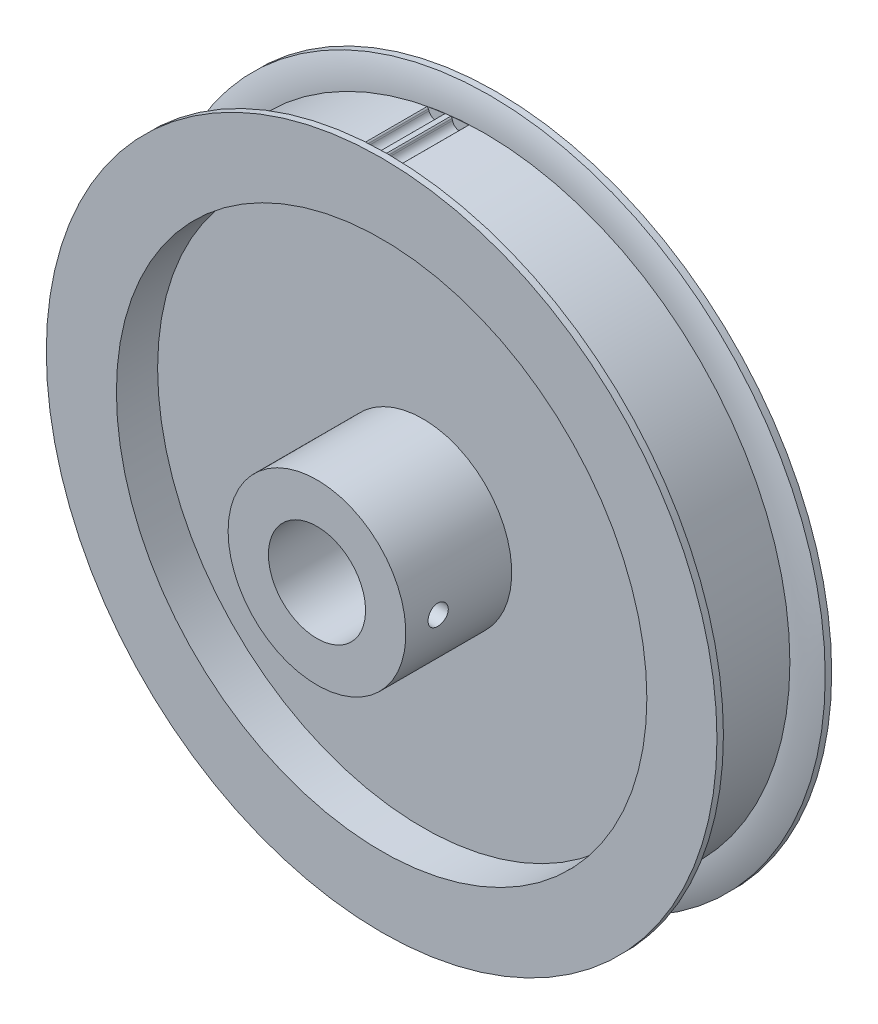
ISO-10303-21;
HEADER;
FILE_DESCRIPTION(('STEP AP214'),'2;1');
FILE_NAME('part.step','',(''),(''),'','','');
FILE_SCHEMA(('AUTOMOTIVE_DESIGN { 1 0 10303 214 1 1 1 1 }'));
ENDSEC;
DATA;
#1=APPLICATION_CONTEXT('core data for automotive mechanical design processes');
#2=APPLICATION_PROTOCOL_DEFINITION('international standard','automotive_design',2000,#1);
#3=PRODUCT_CONTEXT('',#1,'mechanical');
#4=PRODUCT('Part','Part','',(#3));
#5=PRODUCT_RELATED_PRODUCT_CATEGORY('part','',(#4));
#6=PRODUCT_DEFINITION_FORMATION('','',#4);
#7=PRODUCT_DEFINITION_CONTEXT('part definition',#1,'design');
#8=PRODUCT_DEFINITION('design','',#6,#7);
#9=PRODUCT_DEFINITION_SHAPE('','',#8);
#10=(LENGTH_UNIT() NAMED_UNIT(*) SI_UNIT(.MILLI.,.METRE.));
#11=(NAMED_UNIT(*) PLANE_ANGLE_UNIT() SI_UNIT($,.RADIAN.));
#12=(NAMED_UNIT(*) SI_UNIT($,.STERADIAN.) SOLID_ANGLE_UNIT());
#13=UNCERTAINTY_MEASURE_WITH_UNIT(LENGTH_MEASURE(1.E-05),#10,'distance_accuracy_value','');
#14=(GEOMETRIC_REPRESENTATION_CONTEXT(3) GLOBAL_UNCERTAINTY_ASSIGNED_CONTEXT((#13)) GLOBAL_UNIT_ASSIGNED_CONTEXT((#10,
#11,#12)) REPRESENTATION_CONTEXT('',''));
#15=CARTESIAN_POINT('',(0.,0.,0.));
#16=DIRECTION('',(0.,0.,1.));
#17=DIRECTION('',(1.,0.,0.));
#18=AXIS2_PLACEMENT_3D('',#15,#16,#17);
#19=CARTESIAN_POINT('',(0.,0.,-7.1));
#20=DIRECTION('',(0.,0.,-1.));
#21=DIRECTION('',(-1.,0.,0.));
#22=AXIS2_PLACEMENT_3D('',#19,#20,#21);
#23=PLANE('',#22);
#24=CARTESIAN_POINT('',(0.,0.,-7.1));
#25=DIRECTION('',(0.,0.,-1.));
#26=DIRECTION('',(-1.,0.,0.));
#27=AXIS2_PLACEMENT_3D('',#24,#25,#26);
#28=CIRCLE('',#27,32.825);
#29=CARTESIAN_POINT('',(-32.825,0.,-7.1));
#30=VERTEX_POINT('',#29);
#31=EDGE_CURVE('E133',#30,#30,#28,.F.);
#32=ORIENTED_EDGE('',*,*,#31,.T.);
#33=EDGE_LOOP('',(#32));
#34=FACE_BOUND('',#33,.T.);
#35=CARTESIAN_POINT('',(0.,0.,-7.1));
#36=DIRECTION('',(0.,0.,-1.));
#37=DIRECTION('',(-1.,0.,0.));
#38=AXIS2_PLACEMENT_3D('',#35,#36,#37);
#39=CIRCLE('',#38,41.5);
#40=CARTESIAN_POINT('',(-41.5,0.,-7.1));
#41=VERTEX_POINT('',#40);
#42=EDGE_CURVE('E19',#41,#41,#39,.F.);
#43=ORIENTED_EDGE('',*,*,#42,.F.);
#44=EDGE_LOOP('',(#43));
#45=FACE_BOUND('',#44,.T.);
#46=ADVANCED_FACE('F16',(#34,#45),#23,.T.);
#47=CARTESIAN_POINT('',(0.,0.,16.21));
#48=DIRECTION('',(0.,0.,-1.));
#49=DIRECTION('',(-1.,0.,0.));
#50=AXIS2_PLACEMENT_3D('',#47,#48,#49);
#51=CYLINDRICAL_SURFACE('',#50,41.5);
#52=CARTESIAN_POINT('',(0.,0.,-6.29976478792073));
#53=DIRECTION('',(0.,0.,-1.));
#54=DIRECTION('',(0.,-1.,0.));
#55=AXIS2_PLACEMENT_3D('',#52,#53,#54);
#56=CIRCLE('',#55,41.5000000000001);
#57=CARTESIAN_POINT('',(0.,-41.5000000000001,-6.29976478792073));
#58=VERTEX_POINT('',#57);
#59=EDGE_CURVE('E122',#58,#58,#56,.F.);
#60=ORIENTED_EDGE('',*,*,#59,.F.);
#61=EDGE_LOOP('',(#60));
#62=FACE_BOUND('',#61,.T.);
#63=ORIENTED_EDGE('',*,*,#42,.T.);
#64=EDGE_LOOP('',(#63));
#65=FACE_BOUND('',#64,.T.);
#66=ADVANCED_FACE('F316',(#62,#65),#51,.T.);
#67=CARTESIAN_POINT('',(-17.53807496134,32.91539633706,5.55));
#68=DIRECTION('',(0.,0.,1.));
#69=DIRECTION('',(1.,0.,0.));
#70=AXIS2_PLACEMENT_3D('',#67,#68,#69);
#71=CYLINDRICAL_SURFACE('',#70,11.43);
#72=DIRECTION('',(0.,0.,1.));
#73=VECTOR('',#72,1.);
#74=CARTESIAN_POINT('',(-6.86234109410195,36.9987290930293,5.55));
#75=LINE('',#74,#73);
#76=CARTESIAN_POINT('',(-6.8623410941023,36.9987290930262,5.55));
#77=VERTEX_POINT('',#76);
#78=CARTESIAN_POINT('',(-6.8623410941023,36.9987290930262,-5.55));
#79=VERTEX_POINT('',#78);
#80=EDGE_CURVE('E109',#77,#79,#75,.F.);
#81=ORIENTED_EDGE('',*,*,#80,.F.);
#82=CARTESIAN_POINT('',(-17.53807496134,32.91539633706,5.55));
#83=DIRECTION('',(0.,0.,1.));
#84=DIRECTION('',(1.,0.,0.));
#85=AXIS2_PLACEMENT_3D('',#82,#83,#84);
#86=CIRCLE('',#85,11.43);
#87=CARTESIAN_POINT('',(-6.79640029684461,36.8219709750492,5.55));
#88=VERTEX_POINT('',#87);
#89=EDGE_CURVE('E114',#77,#88,#86,.F.);
#90=ORIENTED_EDGE('',*,*,#89,.T.);
#91=DIRECTION('',(0.,0.,1.));
#92=VECTOR('',#91,1.);
#93=CARTESIAN_POINT('',(-6.79640029684293,36.82197097505,5.55));
#94=LINE('',#93,#92);
#95=CARTESIAN_POINT('',(-6.79640029684461,36.8219709750492,-5.55));
#96=VERTEX_POINT('',#95);
#97=EDGE_CURVE('E112',#88,#96,#94,.F.);
#98=ORIENTED_EDGE('',*,*,#97,.T.);
#99=CARTESIAN_POINT('',(-17.53807496134,32.91539633706,-5.55));
#100=DIRECTION('',(0.,0.,1.));
#101=DIRECTION('',(1.,0.,0.));
#102=AXIS2_PLACEMENT_3D('',#99,#100,#101);
#103=CIRCLE('',#102,11.43);
#104=EDGE_CURVE('E103',#96,#79,#103,.T.);
#105=ORIENTED_EDGE('',*,*,#104,.T.);
#106=EDGE_LOOP('',(#81,#90,#98,#105));
#107=FACE_BOUND('',#106,.T.);
#108=ADVANCED_FACE('F108',(#107),#71,.T.);
#109=CARTESIAN_POINT('',(6.508283630513,36.72396538448,5.55));
#110=DIRECTION('',(0.,0.,1.));
#111=DIRECTION('',(1.,0.,0.));
#112=AXIS2_PLACEMENT_3D('',#109,#110,#111);
#113=CYLINDRICAL_SURFACE('',#112,11.43);
#114=DIRECTION('',(0.,0.,1.));
#115=VECTOR('',#114,1.);
#116=CARTESIAN_POINT('',(-4.91485400800908,37.11997863095,5.55));
#117=LINE('',#116,#115);
#118=CARTESIAN_POINT('',(-4.91485400800905,37.1199786309509,-5.55));
#119=VERTEX_POINT('',#118);
#120=CARTESIAN_POINT('',(-4.91485400800906,37.1199786309509,5.55));
#121=VERTEX_POINT('',#120);
#122=EDGE_CURVE('E144',#119,#121,#117,.T.);
#123=ORIENTED_EDGE('',*,*,#122,.T.);
#124=CARTESIAN_POINT('',(6.508283630513,36.72396538448,5.55));
#125=DIRECTION('',(0.,0.,1.));
#126=DIRECTION('',(1.,0.,0.));
#127=AXIS2_PLACEMENT_3D('',#124,#125,#126);
#128=CIRCLE('',#127,11.43);
#129=CARTESIAN_POINT('',(-4.90676184543677,37.3084624178384,5.55));
#130=VERTEX_POINT('',#129);
#131=EDGE_CURVE('E145',#121,#130,#128,.F.);
#132=ORIENTED_EDGE('',*,*,#131,.T.);
#133=DIRECTION('',(0.,0.,1.));
#134=VECTOR('',#133,1.);
#135=CARTESIAN_POINT('',(-4.90676184543697,37.30846241784,5.55));
#136=LINE('',#135,#134);
#137=CARTESIAN_POINT('',(-4.90676184543677,37.3084624178384,-5.55));
#138=VERTEX_POINT('',#137);
#139=EDGE_CURVE('E162',#138,#130,#136,.T.);
#140=ORIENTED_EDGE('',*,*,#139,.F.);
#141=CARTESIAN_POINT('',(6.508283630513,36.72396538448,-5.55));
#142=DIRECTION('',(0.,0.,1.));
#143=DIRECTION('',(1.,0.,0.));
#144=AXIS2_PLACEMENT_3D('',#141,#142,#143);
#145=CIRCLE('',#144,11.43);
#146=EDGE_CURVE('E129',#119,#138,#145,.F.);
#147=ORIENTED_EDGE('',*,*,#146,.F.);
#148=EDGE_LOOP('',(#123,#132,#140,#147));
#149=FACE_BOUND('',#148,.T.);
#150=ADVANCED_FACE('F176',(#149),#113,.T.);
#151=CARTESIAN_POINT('',(-5.884551469768,37.15359575543,5.55));
#152=DIRECTION('',(0.,0.,1.));
#153=DIRECTION('',(1.,0.,0.));
#154=AXIS2_PLACEMENT_3D('',#151,#152,#153);
#155=CYLINDRICAL_SURFACE('',#154,0.97028);
#156=CARTESIAN_POINT('',(-5.884551469768,37.15359575543,-5.55));
#157=DIRECTION('',(0.,0.,1.));
#158=DIRECTION('',(1.,0.,0.));
#159=AXIS2_PLACEMENT_3D('',#156,#157,#158);
#160=CIRCLE('',#159,0.97028);
#161=EDGE_CURVE('E127',#96,#119,#160,.T.);
#162=ORIENTED_EDGE('',*,*,#161,.F.);
#163=ORIENTED_EDGE('',*,*,#97,.F.);
#164=CARTESIAN_POINT('',(-5.884551469768,37.15359575543,5.55));
#165=DIRECTION('',(0.,0.,1.));
#166=DIRECTION('',(1.,0.,0.));
#167=AXIS2_PLACEMENT_3D('',#164,#165,#166);
#168=CIRCLE('',#167,0.97028);
#169=EDGE_CURVE('E152',#88,#121,#168,.T.);
#170=ORIENTED_EDGE('',*,*,#169,.T.);
#171=ORIENTED_EDGE('',*,*,#122,.F.);
#172=EDGE_LOOP('',(#162,#163,#170,#171));
#173=FACE_BOUND('',#172,.T.);
#174=ADVANCED_FACE('F151',(#173),#155,.F.);
#175=CARTESIAN_POINT('',(-14.90149869714,34.18995065739,5.55));
#176=DIRECTION('',(0.,0.,1.));
#177=DIRECTION('',(1.,0.,0.));
#178=AXIS2_PLACEMENT_3D('',#175,#176,#177);
#179=CYLINDRICAL_SURFACE('',#178,11.43);
#180=DIRECTION('',(0.,0.,1.));
#181=VECTOR('',#180,1.);
#182=CARTESIAN_POINT('',(-3.93829995897669,37.4230874357507,5.55));
#183=LINE('',#182,#181);
#184=CARTESIAN_POINT('',(-3.93829995897878,37.4230874357536,5.55));
#185=VERTEX_POINT('',#184);
#186=CARTESIAN_POINT('',(-3.93829995897878,37.4230874357536,-5.55));
#187=VERTEX_POINT('',#186);
#188=EDGE_CURVE('E160',#185,#187,#183,.F.);
#189=ORIENTED_EDGE('',*,*,#188,.F.);
#190=CARTESIAN_POINT('',(-14.90149869714,34.18995065739,5.55));
#191=DIRECTION('',(0.,0.,1.));
#192=DIRECTION('',(1.,0.,0.));
#193=AXIS2_PLACEMENT_3D('',#190,#191,#192);
#194=CIRCLE('',#193,11.43);
#195=CARTESIAN_POINT('',(-3.8864307172929,37.2417005487429,5.55));
#196=VERTEX_POINT('',#195);
#197=EDGE_CURVE('E140',#185,#196,#194,.F.);
#198=ORIENTED_EDGE('',*,*,#197,.T.);
#199=DIRECTION('',(0.,0.,1.));
#200=VECTOR('',#199,1.);
#201=CARTESIAN_POINT('',(-3.88643071729104,37.2417005487403,5.55));
#202=LINE('',#201,#200);
#203=CARTESIAN_POINT('',(-3.8864307172929,37.2417005487429,-5.55));
#204=VERTEX_POINT('',#203);
#205=EDGE_CURVE('E139',#196,#204,#202,.F.);
#206=ORIENTED_EDGE('',*,*,#205,.T.);
#207=CARTESIAN_POINT('',(-14.90149869714,34.18995065739,-5.55));
#208=DIRECTION('',(0.,0.,1.));
#209=DIRECTION('',(1.,0.,0.));
#210=AXIS2_PLACEMENT_3D('',#207,#208,#209);
#211=CIRCLE('',#210,11.43);
#212=EDGE_CURVE('E142',#204,#187,#211,.T.);
#213=ORIENTED_EDGE('',*,*,#212,.T.);
#214=EDGE_LOOP('',(#189,#198,#206,#213));
#215=FACE_BOUND('',#214,.T.);
#216=ADVANCED_FACE('F306',(#215),#179,.T.);
#217=CARTESIAN_POINT('',(9.369549879716,36.10012360681,5.55));
#218=DIRECTION('',(0.,0.,1.));
#219=DIRECTION('',(1.,0.,0.));
#220=AXIS2_PLACEMENT_3D('',#217,#218,#219);
#221=CYLINDRICAL_SURFACE('',#220,11.43);
#222=DIRECTION('',(0.,0.,1.));
#223=VECTOR('',#222,1.);
#224=CARTESIAN_POINT('',(-1.9873031965319,37.3911651261001,5.55));
#225=LINE('',#224,#223);
#226=CARTESIAN_POINT('',(-1.98730319653149,37.3911651261038,-5.55));
#227=VERTEX_POINT('',#226);
#228=CARTESIAN_POINT('',(-1.98730319653122,37.3911651261037,5.55));
#229=VERTEX_POINT('',#228);
#230=EDGE_CURVE('E136',#227,#229,#225,.T.);
#231=ORIENTED_EDGE('',*,*,#230,.T.);
#232=CARTESIAN_POINT('',(9.369549879716,36.10012360681,5.55));
#233=DIRECTION('',(0.,0.,1.));
#234=DIRECTION('',(1.,0.,0.));
#235=AXIS2_PLACEMENT_3D('',#232,#233,#234);
#236=CIRCLE('',#235,11.43);
#237=CARTESIAN_POINT('',(-1.96444771191672,37.5784329766192,5.55));
#238=VERTEX_POINT('',#237);
#239=EDGE_CURVE('E137',#229,#238,#236,.F.);
#240=ORIENTED_EDGE('',*,*,#239,.T.);
#241=DIRECTION('',(0.,0.,1.));
#242=VECTOR('',#241,1.);
#243=CARTESIAN_POINT('',(-1.96444771191669,37.5784329766201,5.55));
#244=LINE('',#243,#242);
#245=CARTESIAN_POINT('',(-1.96444771191672,37.5784329766192,-5.55));
#246=VERTEX_POINT('',#245);
#247=EDGE_CURVE('E578',#246,#238,#244,.T.);
#248=ORIENTED_EDGE('',*,*,#247,.F.);
#249=CARTESIAN_POINT('',(9.369549879716,36.10012360681,-5.55));
#250=DIRECTION('',(0.,0.,1.));
#251=DIRECTION('',(1.,0.,0.));
#252=AXIS2_PLACEMENT_3D('',#249,#250,#251);
#253=CIRCLE('',#252,11.43);
#254=EDGE_CURVE('E582',#227,#246,#253,.F.);
#255=ORIENTED_EDGE('',*,*,#254,.F.);
#256=EDGE_LOOP('',(#231,#240,#248,#255));
#257=FACE_BOUND('',#256,.T.);
#258=ADVANCED_FACE('F302',(#257),#221,.T.);
#259=CARTESIAN_POINT('',(-2.951373835448,37.50076020619,5.55));
#260=DIRECTION('',(0.,0.,1.));
#261=DIRECTION('',(1.,0.,0.));
#262=AXIS2_PLACEMENT_3D('',#259,#260,#261);
#263=CYLINDRICAL_SURFACE('',#262,0.97028);
#264=CARTESIAN_POINT('',(-2.951373835448,37.50076020619,-5.55));
#265=DIRECTION('',(0.,0.,1.));
#266=DIRECTION('',(1.,0.,0.));
#267=AXIS2_PLACEMENT_3D('',#264,#265,#266);
#268=CIRCLE('',#267,0.97028);
#269=EDGE_CURVE('E584',#204,#227,#268,.T.);
#270=ORIENTED_EDGE('',*,*,#269,.F.);
#271=ORIENTED_EDGE('',*,*,#205,.F.);
#272=CARTESIAN_POINT('',(-2.951373835448,37.50076020619,5.55));
#273=DIRECTION('',(0.,0.,1.));
#274=DIRECTION('',(1.,0.,0.));
#275=AXIS2_PLACEMENT_3D('',#272,#273,#274);
#276=CIRCLE('',#275,0.97028);
#277=EDGE_CURVE('E572',#196,#229,#276,.T.);
#278=ORIENTED_EDGE('',*,*,#277,.T.);
#279=ORIENTED_EDGE('',*,*,#230,.F.);
#280=EDGE_LOOP('',(#270,#271,#278,#279));
#281=FACE_BOUND('',#280,.T.);
#282=ADVANCED_FACE('F298',(#281),#263,.F.);
#283=CARTESIAN_POINT('',(0.,0.,7.81));
#284=DIRECTION('',(0.,0.,-1.));
#285=DIRECTION('',(-1.,0.,0.));
#286=AXIS2_PLACEMENT_3D('',#283,#284,#285);
#287=CYLINDRICAL_SURFACE('',#286,32.825);
#288=CARTESIAN_POINT('',(0.,0.,-2.));
#289=DIRECTION('',(0.,0.,-1.));
#290=DIRECTION('',(-1.,0.,0.));
#291=AXIS2_PLACEMENT_3D('',#288,#289,#290);
#292=CIRCLE('',#291,32.825);
#293=CARTESIAN_POINT('',(-32.825,0.,-2.));
#294=VERTEX_POINT('',#293);
#295=EDGE_CURVE('E567',#294,#294,#292,.T.);
#296=ORIENTED_EDGE('',*,*,#295,.F.);
#297=EDGE_LOOP('',(#296));
#298=FACE_BOUND('',#297,.T.);
#299=ORIENTED_EDGE('',*,*,#31,.F.);
#300=EDGE_LOOP('',(#299));
#301=FACE_BOUND('',#300,.T.);
#302=ADVANCED_FACE('F293',(#298,#301),#287,.F.);
#303=CARTESIAN_POINT('',(0.,0.,-15.6));
#304=DIRECTION('',(0.,0.,-1.));
#305=DIRECTION('',(0.,-1.,0.));
#306=AXIS2_PLACEMENT_3D('',#303,#304,#305);
#307=TOROIDAL_SURFACE('',#306,37.825,10.);
#308=CARTESIAN_POINT('',(0.,0.,-5.6));
#309=DIRECTION('',(0.,0.,-1.));
#310=DIRECTION('',(-1.,0.,0.));
#311=AXIS2_PLACEMENT_3D('',#308,#309,#310);
#312=CIRCLE('',#311,37.825);
#313=CARTESIAN_POINT('',(-37.825,0.,-5.6));
#314=VERTEX_POINT('',#313);
#315=EDGE_CURVE('E284',#314,#314,#312,.F.);
#316=ORIENTED_EDGE('',*,*,#315,.F.);
#317=EDGE_LOOP('',(#316));
#318=FACE_BOUND('',#317,.T.);
#319=ORIENTED_EDGE('',*,*,#59,.T.);
#320=EDGE_LOOP('',(#319));
#321=FACE_BOUND('',#320,.T.);
#322=ADVANCED_FACE('F289',(#318,#321),#307,.T.);
#323=CARTESIAN_POINT('',(-7.142282559952,36.89165503409,5.55));
#324=DIRECTION('',(0.,0.,1.));
#325=DIRECTION('',(1.,0.,0.));
#326=AXIS2_PLACEMENT_3D('',#323,#324,#325);
#327=CYLINDRICAL_SURFACE('',#326,0.29972);
#328=CARTESIAN_POINT('',(-7.142282559952,36.89165503409,-5.55));
#329=DIRECTION('',(0.,0.,1.));
#330=DIRECTION('',(1.,0.,0.));
#331=AXIS2_PLACEMENT_3D('',#328,#329,#330);
#332=CIRCLE('',#331,0.29972);
#333=CARTESIAN_POINT('',(-7.02409983000914,37.1670909081955,-5.55));
#334=VERTEX_POINT('',#333);
#335=EDGE_CURVE('E119',#334,#79,#332,.F.);
#336=ORIENTED_EDGE('',*,*,#335,.F.);
#337=DIRECTION('',(0.,0.,-1.));
#338=VECTOR('',#337,1.);
#339=CARTESIAN_POINT('',(-7.02409983000624,37.167090908196,16.21));
#340=LINE('',#339,#338);
#341=CARTESIAN_POINT('',(-7.02409983000914,37.1670909081955,5.55));
#342=VERTEX_POINT('',#341);
#343=EDGE_CURVE('E282',#342,#334,#340,.T.);
#344=ORIENTED_EDGE('',*,*,#343,.F.);
#345=CARTESIAN_POINT('',(-7.142282559952,36.89165503409,5.55));
#346=DIRECTION('',(0.,0.,1.));
#347=DIRECTION('',(1.,0.,0.));
#348=AXIS2_PLACEMENT_3D('',#345,#346,#347);
#349=CIRCLE('',#348,0.29972);
#350=EDGE_CURVE('E121',#342,#77,#349,.F.);
#351=ORIENTED_EDGE('',*,*,#350,.T.);
#352=ORIENTED_EDGE('',*,*,#80,.T.);
#353=EDGE_LOOP('',(#336,#344,#351,#352));
#354=FACE_BOUND('',#353,.T.);
#355=ADVANCED_FACE('F117',(#354),#327,.T.);
#356=CARTESIAN_POINT('',(1.030286966852E-13,0.,-5.55));
#357=DIRECTION('',(0.,0.,1.));
#358=DIRECTION('',(1.,0.,0.));
#359=AXIS2_PLACEMENT_3D('',#356,#357,#358);
#360=PLANE('',#359);
#361=CARTESIAN_POINT('',(-4.60743398629,37.29313560674,-5.55));
#362=DIRECTION('',(0.,0.,1.));
#363=DIRECTION('',(1.,0.,0.));
#364=AXIS2_PLACEMENT_3D('',#361,#362,#363);
#365=CIRCLE('',#364,0.29972);
#366=CARTESIAN_POINT('',(-4.80494680767595,37.5185702176323,-5.55));
#367=VERTEX_POINT('',#366);
#368=EDGE_CURVE('E166',#367,#138,#365,.T.);
#369=ORIENTED_EDGE('',*,*,#368,.F.);
#370=CARTESIAN_POINT('',(0.,0.,-5.55));
#371=DIRECTION('',(0.,0.,-1.));
#372=DIRECTION('',(-1.,0.,0.));
#373=AXIS2_PLACEMENT_3D('',#370,#371,#372);
#374=CIRCLE('',#373,37.825);
#375=EDGE_CURVE('E126',#334,#367,#374,.T.);
#376=ORIENTED_EDGE('',*,*,#375,.F.);
#377=ORIENTED_EDGE('',*,*,#335,.T.);
#378=ORIENTED_EDGE('',*,*,#104,.F.);
#379=ORIENTED_EDGE('',*,*,#161,.T.);
#380=ORIENTED_EDGE('',*,*,#146,.T.);
#381=EDGE_LOOP('',(#369,#376,#377,#378,#379,#380));
#382=FACE_BOUND('',#381,.T.);
#383=ADVANCED_FACE('F125',(#382),#360,.T.);
#384=CARTESIAN_POINT('',(-4.60743398629,37.29313560674,5.55));
#385=DIRECTION('',(0.,0.,1.));
#386=DIRECTION('',(1.,0.,0.));
#387=AXIS2_PLACEMENT_3D('',#384,#385,#386);
#388=CYLINDRICAL_SURFACE('',#387,0.29972);
#389=CARTESIAN_POINT('',(-4.60743398629,37.29313560674,5.55));
#390=DIRECTION('',(0.,0.,1.));
#391=DIRECTION('',(1.,0.,0.));
#392=AXIS2_PLACEMENT_3D('',#389,#390,#391);
#393=CIRCLE('',#392,0.29972);
#394=CARTESIAN_POINT('',(-4.80494680767563,37.5185702176323,5.55));
#395=VERTEX_POINT('',#394);
#396=EDGE_CURVE('E157',#130,#395,#393,.F.);
#397=ORIENTED_EDGE('',*,*,#396,.T.);
#398=DIRECTION('',(0.,0.,-1.));
#399=VECTOR('',#398,1.);
#400=CARTESIAN_POINT('',(-4.8049468076753,37.5185702176324,16.21));
#401=LINE('',#400,#399);
#402=EDGE_CURVE('E175',#367,#395,#401,.F.);
#403=ORIENTED_EDGE('',*,*,#402,.F.);
#404=ORIENTED_EDGE('',*,*,#368,.T.);
#405=ORIENTED_EDGE('',*,*,#139,.T.);
#406=EDGE_LOOP('',(#397,#403,#404,#405));
#407=FACE_BOUND('',#406,.T.);
#408=ADVANCED_FACE('F174',(#407),#388,.T.);
#409=CARTESIAN_POINT('',(1.030286966852E-13,0.,5.55));
#410=DIRECTION('',(0.,0.,1.));
#411=DIRECTION('',(1.,0.,0.));
#412=AXIS2_PLACEMENT_3D('',#409,#410,#411);
#413=PLANE('',#412);
#414=ORIENTED_EDGE('',*,*,#131,.F.);
#415=ORIENTED_EDGE('',*,*,#169,.F.);
#416=ORIENTED_EDGE('',*,*,#89,.F.);
#417=ORIENTED_EDGE('',*,*,#350,.F.);
#418=CARTESIAN_POINT('',(0.,0.,5.55));
#419=DIRECTION('',(0.,0.,-1.));
#420=DIRECTION('',(-1.,0.,0.));
#421=AXIS2_PLACEMENT_3D('',#418,#419,#420);
#422=CIRCLE('',#421,37.825);
#423=EDGE_CURVE('E280',#395,#342,#422,.F.);
#424=ORIENTED_EDGE('',*,*,#423,.F.);
#425=ORIENTED_EDGE('',*,*,#396,.F.);
#426=EDGE_LOOP('',(#414,#415,#416,#417,#424,#425));
#427=FACE_BOUND('',#426,.T.);
#428=ADVANCED_FACE('F154',(#427),#413,.F.);
#429=CARTESIAN_POINT('',(-4.225779392557,37.33830740468,5.55));
#430=DIRECTION('',(0.,0.,1.));
#431=DIRECTION('',(1.,0.,0.));
#432=AXIS2_PLACEMENT_3D('',#429,#430,#431);
#433=CYLINDRICAL_SURFACE('',#432,0.29972);
#434=CARTESIAN_POINT('',(-4.225779392557,37.33830740468,-5.55));
#435=DIRECTION('',(0.,0.,1.));
#436=DIRECTION('',(1.,0.,0.));
#437=AXIS2_PLACEMENT_3D('',#434,#435,#436);
#438=CIRCLE('',#437,0.29972);
#439=CARTESIAN_POINT('',(-4.08635053091159,37.6036216917801,-5.55));
#440=VERTEX_POINT('',#439);
#441=EDGE_CURVE('E586',#440,#187,#438,.F.);
#442=ORIENTED_EDGE('',*,*,#441,.F.);
#443=DIRECTION('',(0.,0.,-1.));
#444=VECTOR('',#443,1.);
#445=CARTESIAN_POINT('',(-4.08635053091399,37.6036216917799,16.21));
#446=LINE('',#445,#444);
#447=CARTESIAN_POINT('',(-4.08635053091159,37.6036216917801,5.55));
#448=VERTEX_POINT('',#447);
#449=EDGE_CURVE('E278',#448,#440,#446,.T.);
#450=ORIENTED_EDGE('',*,*,#449,.F.);
#451=CARTESIAN_POINT('',(-4.225779392557,37.33830740468,5.55));
#452=DIRECTION('',(0.,0.,1.));
#453=DIRECTION('',(1.,0.,0.));
#454=AXIS2_PLACEMENT_3D('',#451,#452,#453);
#455=CIRCLE('',#454,0.29972);
#456=EDGE_CURVE('E575',#448,#185,#455,.F.);
#457=ORIENTED_EDGE('',*,*,#456,.T.);
#458=ORIENTED_EDGE('',*,*,#188,.T.);
#459=EDGE_LOOP('',(#442,#450,#457,#458));
#460=FACE_BOUND('',#459,.T.);
#461=ADVANCED_FACE('F421',(#460),#433,.T.);
#462=CARTESIAN_POINT('',(0.,0.,-5.55));
#463=DIRECTION('',(0.,0.,1.));
#464=DIRECTION('',(1.,0.,0.));
#465=AXIS2_PLACEMENT_3D('',#462,#463,#464);
#466=PLANE('',#465);
#467=CARTESIAN_POINT('',(-1.667245108403,37.53966841981,-5.55));
#468=DIRECTION('',(0.,0.,1.));
#469=DIRECTION('',(1.,0.,0.));
#470=AXIS2_PLACEMENT_3D('',#467,#468,#469);
#471=CIRCLE('',#470,0.29972);
#472=CARTESIAN_POINT('',(-1.8464616679614,37.7799047683917,-5.55));
#473=VERTEX_POINT('',#472);
#474=EDGE_CURVE('E579',#473,#246,#471,.T.);
#475=ORIENTED_EDGE('',*,*,#474,.F.);
#476=CARTESIAN_POINT('',(0.,0.,-5.55));
#477=DIRECTION('',(0.,0.,-1.));
#478=DIRECTION('',(-1.,0.,0.));
#479=AXIS2_PLACEMENT_3D('',#476,#477,#478);
#480=CIRCLE('',#479,37.825);
#481=EDGE_CURVE('E277',#440,#473,#480,.T.);
#482=ORIENTED_EDGE('',*,*,#481,.F.);
#483=ORIENTED_EDGE('',*,*,#441,.T.);
#484=ORIENTED_EDGE('',*,*,#212,.F.);
#485=ORIENTED_EDGE('',*,*,#269,.T.);
#486=ORIENTED_EDGE('',*,*,#254,.T.);
#487=EDGE_LOOP('',(#475,#482,#483,#484,#485,#486));
#488=FACE_BOUND('',#487,.T.);
#489=ADVANCED_FACE('F430',(#488),#466,.T.);
#490=CARTESIAN_POINT('',(-1.667245108403,37.53966841981,5.55));
#491=DIRECTION('',(0.,0.,1.));
#492=DIRECTION('',(1.,0.,0.));
#493=AXIS2_PLACEMENT_3D('',#490,#491,#492);
#494=CYLINDRICAL_SURFACE('',#493,0.29972);
#495=CARTESIAN_POINT('',(-1.667245108403,37.53966841981,5.55));
#496=DIRECTION('',(0.,0.,1.));
#497=DIRECTION('',(1.,0.,0.));
#498=AXIS2_PLACEMENT_3D('',#495,#496,#497);
#499=CIRCLE('',#498,0.29972);
#500=CARTESIAN_POINT('',(-1.84646166796098,37.7799047683918,5.55));
#501=VERTEX_POINT('',#500);
#502=EDGE_CURVE('E570',#238,#501,#499,.F.);
#503=ORIENTED_EDGE('',*,*,#502,.T.);
#504=DIRECTION('',(0.,0.,-1.));
#505=VECTOR('',#504,1.);
#506=CARTESIAN_POINT('',(-1.84646166796009,37.7799047683918,16.21));
#507=LINE('',#506,#505);
#508=EDGE_CURVE('E34',#473,#501,#507,.F.);
#509=ORIENTED_EDGE('',*,*,#508,.F.);
#510=ORIENTED_EDGE('',*,*,#474,.T.);
#511=ORIENTED_EDGE('',*,*,#247,.T.);
#512=EDGE_LOOP('',(#503,#509,#510,#511));
#513=FACE_BOUND('',#512,.T.);
#514=ADVANCED_FACE('F440',(#513),#494,.T.);
#515=CARTESIAN_POINT('',(0.,0.,5.55));
#516=DIRECTION('',(0.,0.,1.));
#517=DIRECTION('',(1.,0.,0.));
#518=AXIS2_PLACEMENT_3D('',#515,#516,#517);
#519=PLANE('',#518);
#520=ORIENTED_EDGE('',*,*,#239,.F.);
#521=ORIENTED_EDGE('',*,*,#277,.F.);
#522=ORIENTED_EDGE('',*,*,#197,.F.);
#523=ORIENTED_EDGE('',*,*,#456,.F.);
#524=CARTESIAN_POINT('',(0.,0.,5.55));
#525=DIRECTION('',(0.,0.,-1.));
#526=DIRECTION('',(-1.,0.,0.));
#527=AXIS2_PLACEMENT_3D('',#524,#525,#526);
#528=CIRCLE('',#527,37.825);
#529=EDGE_CURVE('E276',#501,#448,#528,.F.);
#530=ORIENTED_EDGE('',*,*,#529,.F.);
#531=ORIENTED_EDGE('',*,*,#502,.F.);
#532=EDGE_LOOP('',(#520,#521,#522,#523,#530,#531));
#533=FACE_BOUND('',#532,.T.);
#534=ADVANCED_FACE('F450',(#533),#519,.F.);
#535=CARTESIAN_POINT('',(0.,0.,-2.));
#536=DIRECTION('',(0.,0.,-1.));
#537=DIRECTION('',(-1.,0.,0.));
#538=AXIS2_PLACEMENT_3D('',#535,#536,#537);
#539=PLANE('',#538);
#540=CARTESIAN_POINT('',(0.,0.,-2.));
#541=DIRECTION('',(0.,0.,-1.));
#542=DIRECTION('',(-1.,0.,0.));
#543=AXIS2_PLACEMENT_3D('',#540,#541,#542);
#544=CIRCLE('',#543,11.);
#545=CARTESIAN_POINT('',(-11.,0.,-2.));
#546=VERTEX_POINT('',#545);
#547=EDGE_CURVE('E274',#546,#546,#544,.T.);
#548=ORIENTED_EDGE('',*,*,#547,.F.);
#549=EDGE_LOOP('',(#548));
#550=FACE_BOUND('',#549,.T.);
#551=ORIENTED_EDGE('',*,*,#295,.T.);
#552=EDGE_LOOP('',(#551));
#553=FACE_BOUND('',#552,.T.);
#554=ADVANCED_FACE('F460',(#550,#553),#539,.T.);
#555=CARTESIAN_POINT('',(0.,0.,16.21));
#556=DIRECTION('',(0.,0.,-1.));
#557=DIRECTION('',(-1.,0.,0.));
#558=AXIS2_PLACEMENT_3D('',#555,#556,#557);
#559=CYLINDRICAL_SURFACE('',#558,37.825);
#560=CARTESIAN_POINT('',(0.,0.,5.6));
#561=DIRECTION('',(0.,0.,-1.));
#562=DIRECTION('',(0.,-1.,0.));
#563=AXIS2_PLACEMENT_3D('',#560,#561,#562);
#564=CIRCLE('',#563,37.825);
#565=CARTESIAN_POINT('',(0.,-37.825,5.6));
#566=VERTEX_POINT('',#565);
#567=EDGE_CURVE('E270',#566,#566,#564,.F.);
#568=ORIENTED_EDGE('',*,*,#567,.F.);
#569=EDGE_LOOP('',(#568));
#570=FACE_BOUND('',#569,.T.);
#571=ORIENTED_EDGE('',*,*,#508,.T.);
#572=ORIENTED_EDGE('',*,*,#529,.T.);
#573=ORIENTED_EDGE('',*,*,#449,.T.);
#574=ORIENTED_EDGE('',*,*,#481,.T.);
#575=EDGE_LOOP('',(#571,#572,#573,#574));
#576=FACE_BOUND('',#575,.T.);
#577=ORIENTED_EDGE('',*,*,#402,.T.);
#578=ORIENTED_EDGE('',*,*,#423,.T.);
#579=ORIENTED_EDGE('',*,*,#343,.T.);
#580=ORIENTED_EDGE('',*,*,#375,.T.);
#581=EDGE_LOOP('',(#577,#578,#579,#580));
#582=FACE_BOUND('',#581,.T.);
#583=ORIENTED_EDGE('',*,*,#315,.T.);
#584=EDGE_LOOP('',(#583));
#585=FACE_BOUND('',#584,.T.);
#586=ADVANCED_FACE('F470',(#570,#576,#582,#585),#559,.T.);
#587=CARTESIAN_POINT('',(0.,0.,7.81));
#588=DIRECTION('',(0.,0.,-1.));
#589=DIRECTION('',(-1.,0.,0.));
#590=AXIS2_PLACEMENT_3D('',#587,#588,#589);
#591=CYLINDRICAL_SURFACE('',#590,11.);
#592=ORIENTED_EDGE('',*,*,#547,.T.);
#593=EDGE_LOOP('',(#592));
#594=FACE_BOUND('',#593,.T.);
#595=CARTESIAN_POINT('',(0.,0.,-7.1));
#596=DIRECTION('',(0.,0.,-1.));
#597=DIRECTION('',(-1.,0.,0.));
#598=AXIS2_PLACEMENT_3D('',#595,#596,#597);
#599=CIRCLE('',#598,11.);
#600=CARTESIAN_POINT('',(-11.,0.,-7.1));
#601=VERTEX_POINT('',#600);
#602=EDGE_CURVE('E273',#601,#601,#599,.T.);
#603=ORIENTED_EDGE('',*,*,#602,.F.);
#604=EDGE_LOOP('',(#603));
#605=FACE_BOUND('',#604,.T.);
#606=ADVANCED_FACE('F263',(#594,#605),#591,.T.);
#607=CARTESIAN_POINT('',(0.,0.,15.6));
#608=DIRECTION('',(0.,0.,-1.));
#609=DIRECTION('',(0.,-1.,0.));
#610=AXIS2_PLACEMENT_3D('',#607,#608,#609);
#611=TOROIDAL_SURFACE('',#610,37.825,10.);
#612=CARTESIAN_POINT('',(0.,0.,6.299764787921));
#613=DIRECTION('',(0.,0.,-1.));
#614=DIRECTION('',(-1.,0.,0.));
#615=AXIS2_PLACEMENT_3D('',#612,#613,#614);
#616=CIRCLE('',#615,41.5);
#617=CARTESIAN_POINT('',(-41.5,0.,6.299764787921));
#618=VERTEX_POINT('',#617);
#619=EDGE_CURVE('E269',#618,#618,#616,.F.);
#620=ORIENTED_EDGE('',*,*,#619,.F.);
#621=EDGE_LOOP('',(#620));
#622=FACE_BOUND('',#621,.T.);
#623=ORIENTED_EDGE('',*,*,#567,.T.);
#624=EDGE_LOOP('',(#623));
#625=FACE_BOUND('',#624,.T.);
#626=ADVANCED_FACE('F258',(#622,#625),#611,.T.);
#627=CARTESIAN_POINT('',(0.,0.,-7.1));
#628=DIRECTION('',(0.,0.,-1.));
#629=DIRECTION('',(-1.,0.,0.));
#630=AXIS2_PLACEMENT_3D('',#627,#628,#629);
#631=PLANE('',#630);
#632=CARTESIAN_POINT('',(0.,0.,-7.1));
#633=DIRECTION('',(0.,0.,-1.));
#634=DIRECTION('',(-1.,0.,0.));
#635=AXIS2_PLACEMENT_3D('',#632,#633,#634);
#636=CIRCLE('',#635,6.01075);
#637=CARTESIAN_POINT('',(-6.01075,0.,-7.1));
#638=VERTEX_POINT('',#637);
#639=EDGE_CURVE('E553',#638,#638,#636,.F.);
#640=ORIENTED_EDGE('',*,*,#639,.T.);
#641=EDGE_LOOP('',(#640));
#642=FACE_BOUND('',#641,.T.);
#643=ORIENTED_EDGE('',*,*,#602,.T.);
#644=EDGE_LOOP('',(#643));
#645=FACE_BOUND('',#644,.T.);
#646=ADVANCED_FACE('F254',(#642,#645),#631,.T.);
#647=CARTESIAN_POINT('',(0.,0.,16.21));
#648=DIRECTION('',(0.,0.,-1.));
#649=DIRECTION('',(-1.,0.,0.));
#650=AXIS2_PLACEMENT_3D('',#647,#648,#649);
#651=CYLINDRICAL_SURFACE('',#650,41.5);
#652=CARTESIAN_POINT('',(0.,0.,7.1));
#653=DIRECTION('',(0.,0.,-1.));
#654=DIRECTION('',(-1.,0.,0.));
#655=AXIS2_PLACEMENT_3D('',#652,#653,#654);
#656=CIRCLE('',#655,41.5);
#657=CARTESIAN_POINT('',(-41.5,0.,7.1));
#658=VERTEX_POINT('',#657);
#659=EDGE_CURVE('E239',#658,#658,#656,.T.);
#660=ORIENTED_EDGE('',*,*,#659,.T.);
#661=EDGE_LOOP('',(#660));
#662=FACE_BOUND('',#661,.T.);
#663=ORIENTED_EDGE('',*,*,#619,.T.);
#664=EDGE_LOOP('',(#663));
#665=FACE_BOUND('',#664,.T.);
#666=ADVANCED_FACE('F250',(#662,#665),#651,.T.);
#667=CARTESIAN_POINT('',(0.,0.,16.21));
#668=DIRECTION('',(0.,0.,-1.));
#669=DIRECTION('',(-1.,0.,0.));
#670=AXIS2_PLACEMENT_3D('',#667,#668,#669);
#671=CYLINDRICAL_SURFACE('',#670,6.01075);
#672=ORIENTED_EDGE('',*,*,#639,.F.);
#673=EDGE_LOOP('',(#672));
#674=FACE_BOUND('',#673,.T.);
#675=CARTESIAN_POINT('',(6.01075,0.,12.35));
#676=CARTESIAN_POINT('',(6.01074831828351,-0.0693383530193138,12.349996640135));
#677=CARTESIAN_POINT('',(6.00953674755327,-0.138762118535501,12.3442056829262));
#678=CARTESIAN_POINT('',(6.00481648233229,-0.275699929273368,12.3211992050366));
#679=CARTESIAN_POINT('',(6.00130327335242,-0.343209948769201,12.3039612309926));
#680=CARTESIAN_POINT('',(5.99237186853797,-0.474236594265014,12.258618115271));
#681=CARTESIAN_POINT('',(5.98695645444153,-0.537758892776938,12.2305288363212));
#682=CARTESIAN_POINT('',(5.97480901204151,-0.659165988407888,12.1643221444703));
#683=CARTESIAN_POINT('',(5.96807740537484,-0.717052582029808,12.1262079416662));
#684=CARTESIAN_POINT('',(5.95392535495637,-0.826421765111193,12.0404358372211));
#685=CARTESIAN_POINT('',(5.94649700145599,-0.87780989046499,11.9926587665423));
#686=CARTESIAN_POINT('',(5.93184519779275,-0.971905993846944,11.889170935754));
#687=CARTESIAN_POINT('',(5.92462177562575,-1.01461279077695,11.8334590978675));
#688=CARTESIAN_POINT('',(5.91112141560371,-1.09053461718598,11.7150047871167));
#689=CARTESIAN_POINT('',(5.90485453154835,-1.12365172364193,11.6521983038773));
#690=CARTESIAN_POINT('',(5.89408857692198,-1.17882602406286,11.5217607412831));
#691=CARTESIAN_POINT('',(5.88958930182393,-1.20088449768518,11.45413022118));
#692=CARTESIAN_POINT('',(5.88294749312056,-1.23300942758607,11.3169751692127));
#693=CARTESIAN_POINT('',(5.88077257118537,-1.24324085496556,11.2474908785457));
#694=CARTESIAN_POINT('',(5.87892832835054,-1.25193389288544,11.1077604593652));
#695=CARTESIAN_POINT('',(5.87925873366171,-1.25039678952378,11.037514414936));
#696=CARTESIAN_POINT('',(5.88235842415104,-1.23572955222492,10.8994702066209));
#697=CARTESIAN_POINT('',(5.88508768278978,-1.22278967243806,10.8316507944319));
#698=CARTESIAN_POINT('',(5.89261446246147,-1.18598479495957,10.6991664462996));
#699=CARTESIAN_POINT('',(5.89741210489079,-1.16211915601454,10.6345016957559));
#700=CARTESIAN_POINT('',(5.90857555953963,-1.10396060822456,10.5096182159965));
#701=CARTESIAN_POINT('',(5.91495255511703,-1.06959291006896,10.449435357727));
#702=CARTESIAN_POINT('',(5.92854854863811,-0.991461155186248,10.3356243113082));
#703=CARTESIAN_POINT('',(5.93576758975977,-0.947696616515932,10.2819964595723));
#704=CARTESIAN_POINT('',(5.95040607439784,-0.85100807253617,10.1817249894122));
#705=CARTESIAN_POINT('',(5.95782669569292,-0.797923499181407,10.135236254288));
#706=CARTESIAN_POINT('',(5.97190824356839,-0.684603574361891,10.0517775371466));
#707=CARTESIAN_POINT('',(5.97856883710417,-0.624365111474219,10.0148117192222));
#708=CARTESIAN_POINT('',(5.99039909996156,-0.498251828614924,9.95141764521063));
#709=CARTESIAN_POINT('',(5.99556490333262,-0.432362955016158,9.92501664646413));
#710=CARTESIAN_POINT('',(6.0037866494949,-0.297037247454842,9.88375450512287));
#711=CARTESIAN_POINT('',(6.00684701491246,-0.227608181707903,9.86886916480051));
#712=CARTESIAN_POINT('',(6.00937161551339,-0.131370174291004,9.85664250856971));
#713=CARTESIAN_POINT('',(6.00988733483688,-0.105164233585159,9.85415374357078));
#714=CARTESIAN_POINT('',(6.01057684661451,-0.0526429666894187,9.85083185014987));
#715=CARTESIAN_POINT('',(6.01075063854454,-0.0263276403319186,9.84999872426566));
#716=CARTESIAN_POINT('',(6.01074831828351,0.0693383530193137,9.85000335986501));
#717=CARTESIAN_POINT('',(6.00953674755327,0.1387621185355,9.8557943170738));
#718=CARTESIAN_POINT('',(6.00481648233229,0.275699929273367,9.87880079496335));
#719=CARTESIAN_POINT('',(6.00130327335242,0.343209948769201,9.89603876900741));
#720=CARTESIAN_POINT('',(5.99237186853797,0.474236594265015,9.94138188472905));
#721=CARTESIAN_POINT('',(5.98695645444153,0.53775889277694,9.9694711636788));
#722=CARTESIAN_POINT('',(5.97480901204151,0.659165988407889,10.0356778555297));
#723=CARTESIAN_POINT('',(5.96807740537484,0.717052582029809,10.0737920583338));
#724=CARTESIAN_POINT('',(5.95392535495637,0.826421765111194,10.1595641627789));
#725=CARTESIAN_POINT('',(5.94649700145599,0.87780989046499,10.2073412334577));
#726=CARTESIAN_POINT('',(5.93184519779275,0.971905993846945,10.310829064246));
#727=CARTESIAN_POINT('',(5.92462177562575,1.01461279077695,10.3665409021326));
#728=CARTESIAN_POINT('',(5.91112141560371,1.09053461718598,10.4849952128833));
#729=CARTESIAN_POINT('',(5.90485453154835,1.12365172364193,10.5478016961227));
#730=CARTESIAN_POINT('',(5.89408857692198,1.17882602406286,10.6782392587169));
#731=CARTESIAN_POINT('',(5.88958930182393,1.20088449768519,10.74586977882));
#732=CARTESIAN_POINT('',(5.88294749312056,1.23300942758607,10.8830248307873));
#733=CARTESIAN_POINT('',(5.88077257118537,1.24324085496556,10.9525091214543));
#734=CARTESIAN_POINT('',(5.87892832835054,1.25193389288544,11.0922395406348));
#735=CARTESIAN_POINT('',(5.87925873366171,1.25039678952378,11.162485585064));
#736=CARTESIAN_POINT('',(5.88235842415104,1.23572955222492,11.3005297933791));
#737=CARTESIAN_POINT('',(5.88508768278978,1.22278967243806,11.3683492055681));
#738=CARTESIAN_POINT('',(5.89261446246147,1.18598479495957,11.5008335537004));
#739=CARTESIAN_POINT('',(5.89741210489079,1.16211915601454,11.5654983042441));
#740=CARTESIAN_POINT('',(5.90857555953963,1.10396060822456,11.6903817840035));
#741=CARTESIAN_POINT('',(5.91495255511703,1.06959291006896,11.750564642273));
#742=CARTESIAN_POINT('',(5.92854854863811,0.991461155186247,11.8643756886918));
#743=CARTESIAN_POINT('',(5.93576758975977,0.94769661651593,11.9180035404277));
#744=CARTESIAN_POINT('',(5.95040607439784,0.851008072536169,12.0182750105878));
#745=CARTESIAN_POINT('',(5.95782669569292,0.797923499181406,12.064763745712));
#746=CARTESIAN_POINT('',(5.97190824356839,0.68460357436189,12.1482224628534));
#747=CARTESIAN_POINT('',(5.97856883710417,0.624365111474219,12.1851882807778));
#748=CARTESIAN_POINT('',(5.99039909996156,0.498251828614923,12.2485823547894));
#749=CARTESIAN_POINT('',(5.99556490333262,0.432362955016157,12.2749833535359));
#750=CARTESIAN_POINT('',(6.0037866494949,0.29703724745484,12.3162454948771));
#751=CARTESIAN_POINT('',(6.00684701491246,0.227608181707902,12.3311308351995));
#752=CARTESIAN_POINT('',(6.00937161551339,0.131370174291003,12.3433574914303));
#753=CARTESIAN_POINT('',(6.00988733483688,0.105164233585158,12.3458462564292));
#754=CARTESIAN_POINT('',(6.01057684661451,0.0526429666894183,12.3491681498501));
#755=CARTESIAN_POINT('',(6.01075063854454,0.0263276403319184,12.3500012757343));
#756=CARTESIAN_POINT('',(6.01075,0.,12.35));
#757=B_SPLINE_CURVE_WITH_KNOTS('',3,(#675,#676,#677,#678,#679,#680,#681,#682,#683,#684,#685,
#686,#687,#688,#689,#690,#691,#692,#693,#694,#695,#696,#697,#698,#699,#700,#701,#702,#703,#704,
#705,#706,#707,#708,#709,#710,#711,#712,#713,#714,#715,#716,#717,#718,#719,#720,#721,#722,#723,
#724,#725,#726,#727,#728,#729,#730,#731,#732,#733,#734,#735,#736,#737,#738,#739,#740,#741,#742,
#743,#744,#745,#746,#747,#748,#749,#750,#751,#752,#753,#754,#755,#756),.UNSPECIFIED.,.T.,.F.,(4,
2,2,2,2,2,2,2,2,2,2,2,2,2,2,2,2,2,2,2,2,2,2,2,2,2,2,2,2,2,2,2,2,2,2,2,2,2,2,2,4),(0.,
0.207914362576265,0.416237759311185,0.624257768708173,0.832211248604316,1.04290565270078,
1.25362870269719,1.46643319818789,1.67921306317248,1.88898769580976,2.0987394040161,
2.3050563178445,2.51138534235457,2.71921938223629,2.92706408401433,3.13892275381721,
3.35087390656745,3.56336842334045,3.77541520567757,3.8543597714051,3.93330445813891,
4.14121882071517,4.34954221745009,4.55756222684708,4.76551570674322,4.97621011083968,
5.1869331608361,5.3997376563268,5.61251752131139,5.82229215394866,6.03204386215501,
6.23836077598341,6.44468980049348,6.6525238403752,6.86036854215324,7.07222721195612,
7.28417836470636,7.49667288147935,7.70871966381648,7.78766422954401,7.86660891627782),.UNSPECIFIED.);
#758=CARTESIAN_POINT('',(6.01075,0.,12.35));
#759=VERTEX_POINT('',#758);
#760=EDGE_CURVE('E236',#759,#759,#757,.T.);
#761=ORIENTED_EDGE('',*,*,#760,.T.);
#762=EDGE_LOOP('',(#761));
#763=FACE_BOUND('',#762,.T.);
#764=CARTESIAN_POINT('',(0.,0.,15.1));
#765=DIRECTION('',(0.,0.,-1.));
#766=DIRECTION('',(-1.,0.,0.));
#767=AXIS2_PLACEMENT_3D('',#764,#765,#766);
#768=CIRCLE('',#767,6.01075);
#769=CARTESIAN_POINT('',(-6.01075,0.,15.1));
#770=VERTEX_POINT('',#769);
#771=EDGE_CURVE('E234',#770,#770,#768,.F.);
#772=ORIENTED_EDGE('',*,*,#771,.T.);
#773=EDGE_LOOP('',(#772));
#774=FACE_BOUND('',#773,.T.);
#775=ADVANCED_FACE('F246',(#674,#763,#774),#671,.F.);
#776=CARTESIAN_POINT('',(0.,0.,7.1));
#777=DIRECTION('',(0.,0.,-1.));
#778=DIRECTION('',(-1.,0.,0.));
#779=AXIS2_PLACEMENT_3D('',#776,#777,#778);
#780=PLANE('',#779);
#781=CARTESIAN_POINT('',(0.,0.,7.1));
#782=DIRECTION('',(0.,0.,-1.));
#783=DIRECTION('',(-1.,0.,0.));
#784=AXIS2_PLACEMENT_3D('',#781,#782,#783);
#785=CIRCLE('',#784,32.825);
#786=CARTESIAN_POINT('',(-32.825,0.,7.1));
#787=VERTEX_POINT('',#786);
#788=EDGE_CURVE('E196',#787,#787,#785,.T.);
#789=ORIENTED_EDGE('',*,*,#788,.T.);
#790=EDGE_LOOP('',(#789));
#791=FACE_BOUND('',#790,.T.);
#792=ORIENTED_EDGE('',*,*,#659,.F.);
#793=EDGE_LOOP('',(#792));
#794=FACE_BOUND('',#793,.T.);
#795=ADVANCED_FACE('F219',(#791,#794),#780,.F.);
#796=CARTESIAN_POINT('',(11.,0.,11.1));
#797=DIRECTION('',(1.,0.,0.));
#798=DIRECTION('',(0.,0.,-1.));
#799=AXIS2_PLACEMENT_3D('',#796,#797,#798);
#800=CYLINDRICAL_SURFACE('',#799,1.25);
#801=CARTESIAN_POINT('',(11.,0.,9.85));
#802=CARTESIAN_POINT('',(10.9999991148521,-0.0699080585435713,9.85000304709291));
#803=CARTESIAN_POINT('',(10.9993260036346,-0.139908213344394,9.85588888539083));
#804=CARTESIAN_POINT('',(10.9967041544219,-0.278012070055905,9.87929008827795));
#805=CARTESIAN_POINT('',(10.9947527507188,-0.346111498160375,9.89682975646719));
#806=CARTESIAN_POINT('',(10.9897942670758,-0.478323113089338,9.94302033644563));
#807=CARTESIAN_POINT('',(10.9867882735794,-0.542439323731044,9.9716598163241));
#808=CARTESIAN_POINT('',(10.9800565656254,-0.664924666689567,10.0392142864028));
#809=CARTESIAN_POINT('',(10.9763311577077,-0.723296230845279,10.0781249026887));
#810=CARTESIAN_POINT('',(10.9685571683731,-0.832941684670879,10.1653159667095));
#811=CARTESIAN_POINT('',(10.9645072994936,-0.884184842285312,10.213634952799));
#812=CARTESIAN_POINT('',(10.9565511963248,-0.977855552100844,10.3181907248464));
#813=CARTESIAN_POINT('',(10.9526449761367,-1.02028224073645,10.3744282855177));
#814=CARTESIAN_POINT('',(10.9454061896313,-1.09522128832009,10.4934137457158));
#815=CARTESIAN_POINT('',(10.9420752258707,-1.12770613929229,10.5561790761475));
#816=CARTESIAN_POINT('',(10.9363802201197,-1.18166332078574,10.6863175573355));
#817=CARTESIAN_POINT('',(10.9340161392207,-1.20313609445467,10.753690522548));
#818=CARTESIAN_POINT('',(10.9305342791412,-1.23436979991613,10.8908231066721));
#819=CARTESIAN_POINT('',(10.9294111496626,-1.24418102386214,10.9605711327216));
#820=CARTESIAN_POINT('',(10.9285218896951,-1.25196866272464,11.1007322841483));
#821=CARTESIAN_POINT('',(10.9287557161489,-1.24994545315733,11.1711453883512));
#822=CARTESIAN_POINT('',(10.930549051946,-1.2341630536453,11.3102884981611));
#823=CARTESIAN_POINT('',(10.9321023179558,-1.22045913352949,11.37902486464));
#824=CARTESIAN_POINT('',(10.9363497998215,-1.18179022454947,11.5132164383912));
#825=CARTESIAN_POINT('',(10.9390440453143,-1.15682494317077,11.5786715603839));
#826=CARTESIAN_POINT('',(10.9452771541877,-1.09628082898074,11.7046171393102));
#827=CARTESIAN_POINT('',(10.9488179728009,-1.06067737816088,11.7650956611924));
#828=CARTESIAN_POINT('',(10.9563433260192,-0.979888347502977,11.8792351593756));
#829=CARTESIAN_POINT('',(10.9603278411368,-0.934703188420786,11.9328964348727));
#830=CARTESIAN_POINT('',(10.968318914379,-0.835735030646136,12.0321952521566));
#831=CARTESIAN_POINT('',(10.9723254728927,-0.781905993521718,12.0777869155452));
#832=CARTESIAN_POINT('',(10.9798905247649,-0.667305097496763,12.1593157361149));
#833=CARTESIAN_POINT('',(10.9834488114142,-0.606530060080166,12.1952484479094));
#834=CARTESIAN_POINT('',(10.9897183731384,-0.479712953049675,12.2564345069875));
#835=CARTESIAN_POINT('',(10.9924287382283,-0.413665319644024,12.2816763911352));
#836=CARTESIAN_POINT('',(10.9966857224793,-0.278321185017152,12.320646388054));
#837=CARTESIAN_POINT('',(10.9982348067932,-0.209031899463274,12.3343988974793));
#838=CARTESIAN_POINT('',(10.9994122488542,-0.11606163277118,12.3448183485388));
#839=CARTESIAN_POINT('',(10.9996322133545,-0.0928952079605254,12.3467600188117));
#840=CARTESIAN_POINT('',(10.9999262361378,-0.0464892509310552,12.3493513514239));
#841=CARTESIAN_POINT('',(11.0000002943786,-0.0232497186910642,12.3500010133889));
#842=CARTESIAN_POINT('',(10.9999991148521,0.0699080585435722,12.3499969529071));
#843=CARTESIAN_POINT('',(10.9993260036346,0.139908213344395,12.3441111146092));
#844=CARTESIAN_POINT('',(10.9967041544219,0.278012070055906,12.3207099117221));
#845=CARTESIAN_POINT('',(10.9947527507188,0.346111498160376,12.3031702435328));
#846=CARTESIAN_POINT('',(10.9897942670758,0.47832311308934,12.2569796635544));
#847=CARTESIAN_POINT('',(10.9867882735794,0.542439323731046,12.2283401836759));
#848=CARTESIAN_POINT('',(10.9800565656254,0.66492466668957,12.1607857135972));
#849=CARTESIAN_POINT('',(10.9763311577077,0.723296230845281,12.1218750973113));
#850=CARTESIAN_POINT('',(10.9685571683731,0.83294168467088,12.0346840332905));
#851=CARTESIAN_POINT('',(10.9645072994936,0.884184842285313,11.986365047201));
#852=CARTESIAN_POINT('',(10.9565511963248,0.977855552100845,11.8818092751536));
#853=CARTESIAN_POINT('',(10.9526449761367,1.02028224073645,11.8255717144823));
#854=CARTESIAN_POINT('',(10.9454061896313,1.09522128832009,11.7065862542842));
#855=CARTESIAN_POINT('',(10.9420752258707,1.12770613929229,11.6438209238525));
#856=CARTESIAN_POINT('',(10.9363802201197,1.18166332078574,11.5136824426645));
#857=CARTESIAN_POINT('',(10.9340161392207,1.20313609445467,11.446309477452));
#858=CARTESIAN_POINT('',(10.9305342791412,1.23436979991613,11.3091768933279));
#859=CARTESIAN_POINT('',(10.9294111496626,1.24418102386214,11.2394288672784));
#860=CARTESIAN_POINT('',(10.9285218896951,1.25196866272464,11.0992677158517));
#861=CARTESIAN_POINT('',(10.9287557161489,1.24994545315733,11.0288546116488));
#862=CARTESIAN_POINT('',(10.930549051946,1.2341630536453,10.8897115018389));
#863=CARTESIAN_POINT('',(10.9321023179558,1.22045913352949,10.82097513536));
#864=CARTESIAN_POINT('',(10.9363497998215,1.18179022454947,10.6867835616088));
#865=CARTESIAN_POINT('',(10.9390440453143,1.15682494317077,10.6213284396161));
#866=CARTESIAN_POINT('',(10.9452771541877,1.09628082898074,10.4953828606898));
#867=CARTESIAN_POINT('',(10.9488179728009,1.06067737816088,10.4349043388076));
#868=CARTESIAN_POINT('',(10.9563433260192,0.979888347502975,10.3207648406244));
#869=CARTESIAN_POINT('',(10.9603278411368,0.934703188420784,10.2671035651273));
#870=CARTESIAN_POINT('',(10.968318914379,0.835735030646134,10.1678047478434));
#871=CARTESIAN_POINT('',(10.9723254728927,0.781905993521716,10.1222130844548));
#872=CARTESIAN_POINT('',(10.9798905247649,0.667305097496762,10.0406842638851));
#873=CARTESIAN_POINT('',(10.9834488114142,0.606530060080166,10.0047515520906));
#874=CARTESIAN_POINT('',(10.9897183731384,0.479712953049674,9.94356549301246));
#875=CARTESIAN_POINT('',(10.9924287382283,0.413665319644023,9.91832360886478));
#876=CARTESIAN_POINT('',(10.9966857224793,0.27832118501715,9.87935361194596));
#877=CARTESIAN_POINT('',(10.9982348067932,0.209031899463273,9.8656011025207));
#878=CARTESIAN_POINT('',(10.9994122488542,0.116061632771179,9.85518165146117));
#879=CARTESIAN_POINT('',(10.9996322133545,0.0928952079605249,9.85323998118828));
#880=CARTESIAN_POINT('',(10.9999262361378,0.0464892509310555,9.85064864857611));
#881=CARTESIAN_POINT('',(11.0000002943786,0.0232497186910648,9.84999898661107));
#882=CARTESIAN_POINT('',(11.,0.,9.85));
#883=B_SPLINE_CURVE_WITH_KNOTS('',3,(#801,#802,#803,#804,#805,#806,#807,#808,#809,#810,#811,
#812,#813,#814,#815,#816,#817,#818,#819,#820,#821,#822,#823,#824,#825,#826,#827,#828,#829,#830,
#831,#832,#833,#834,#835,#836,#837,#838,#839,#840,#841,#842,#843,#844,#845,#846,#847,#848,#849,
#850,#851,#852,#853,#854,#855,#856,#857,#858,#859,#860,#861,#862,#863,#864,#865,#866,#867,#868,
#869,#870,#871,#872,#873,#874,#875,#876,#877,#878,#879,#880,#881,#882),.UNSPECIFIED.,.T.,.F.,(4,
2,2,2,2,2,2,2,2,2,2,2,2,2,2,2,2,2,2,2,2,2,2,2,2,2,2,2,2,2,2,2,2,2,2,2,2,2,2,2,4),(0.,
0.209635602818747,0.419709770367451,0.629568150965858,0.839337308146196,1.04998451391222,
1.26065234267435,1.47189790351134,1.68313496274368,1.89345768680193,2.10377373718551,
2.31310012077727,2.52243194194677,2.73225198421813,2.94206281469414,3.15303063956093,
3.36409539358254,3.57538589028048,3.78622658197861,3.85594626069468,3.9256659596065,
4.13530156242525,4.34537572997395,4.55523411057236,4.7650032677527,4.97565047351872,
5.18631830228085,5.39756386311784,5.60880092235018,5.81912364640844,6.02943969679202,
6.23876608038377,6.44809790155327,6.65791794382463,6.86772877430065,7.07869659916743,
7.28976135318904,7.50105184988698,7.71189254158511,7.78161222030118,7.851331919213),.UNSPECIFIED.);
#884=CARTESIAN_POINT('',(11.,0.,9.85));
#885=VERTEX_POINT('',#884);
#886=EDGE_CURVE('E189',#885,#885,#883,.T.);
#887=ORIENTED_EDGE('',*,*,#886,.F.);
#888=EDGE_LOOP('',(#887));
#889=FACE_BOUND('',#888,.T.);
#890=ORIENTED_EDGE('',*,*,#760,.F.);
#891=EDGE_LOOP('',(#890));
#892=FACE_BOUND('',#891,.T.);
#893=ADVANCED_FACE('F198',(#889,#892),#800,.F.);
#894=CARTESIAN_POINT('',(0.,0.,15.1));
#895=DIRECTION('',(0.,0.,-1.));
#896=DIRECTION('',(-1.,0.,0.));
#897=AXIS2_PLACEMENT_3D('',#894,#895,#896);
#898=PLANE('',#897);
#899=ORIENTED_EDGE('',*,*,#771,.F.);
#900=EDGE_LOOP('',(#899));
#901=FACE_BOUND('',#900,.T.);
#902=CARTESIAN_POINT('',(0.,0.,15.1));
#903=DIRECTION('',(0.,0.,-1.));
#904=DIRECTION('',(-1.,0.,0.));
#905=AXIS2_PLACEMENT_3D('',#902,#903,#904);
#906=CIRCLE('',#905,11.);
#907=CARTESIAN_POINT('',(-11.,0.,15.1));
#908=VERTEX_POINT('',#907);
#909=EDGE_CURVE('E186',#908,#908,#906,.T.);
#910=ORIENTED_EDGE('',*,*,#909,.F.);
#911=EDGE_LOOP('',(#910));
#912=FACE_BOUND('',#911,.T.);
#913=ADVANCED_FACE('F211',(#901,#912),#898,.F.);
#914=CARTESIAN_POINT('',(0.,0.,7.81));
#915=DIRECTION('',(0.,0.,-1.));
#916=DIRECTION('',(-1.,0.,0.));
#917=AXIS2_PLACEMENT_3D('',#914,#915,#916);
#918=CYLINDRICAL_SURFACE('',#917,32.825);
#919=CARTESIAN_POINT('',(0.,0.,2.));
#920=DIRECTION('',(0.,0.,-1.));
#921=DIRECTION('',(-1.,0.,0.));
#922=AXIS2_PLACEMENT_3D('',#919,#920,#921);
#923=CIRCLE('',#922,32.825);
#924=CARTESIAN_POINT('',(-32.825,0.,2.));
#925=VERTEX_POINT('',#924);
#926=EDGE_CURVE('E25',#925,#925,#923,.T.);
#927=ORIENTED_EDGE('',*,*,#926,.T.);
#928=EDGE_LOOP('',(#927));
#929=FACE_BOUND('',#928,.T.);
#930=ORIENTED_EDGE('',*,*,#788,.F.);
#931=EDGE_LOOP('',(#930));
#932=FACE_BOUND('',#931,.T.);
#933=ADVANCED_FACE('F208',(#929,#932),#918,.F.);
#934=CARTESIAN_POINT('',(0.,0.,16.21));
#935=DIRECTION('',(0.,0.,-1.));
#936=DIRECTION('',(-1.,0.,0.));
#937=AXIS2_PLACEMENT_3D('',#934,#935,#936);
#938=CYLINDRICAL_SURFACE('',#937,11.);
#939=CARTESIAN_POINT('',(0.,0.,2.));
#940=DIRECTION('',(0.,0.,-1.));
#941=DIRECTION('',(-1.,0.,0.));
#942=AXIS2_PLACEMENT_3D('',#939,#940,#941);
#943=CIRCLE('',#942,11.);
#944=CARTESIAN_POINT('',(-11.,0.,2.));
#945=VERTEX_POINT('',#944);
#946=EDGE_CURVE('E11',#945,#945,#943,.F.);
#947=ORIENTED_EDGE('',*,*,#946,.T.);
#948=EDGE_LOOP('',(#947));
#949=FACE_BOUND('',#948,.T.);
#950=ORIENTED_EDGE('',*,*,#909,.T.);
#951=EDGE_LOOP('',(#950));
#952=FACE_BOUND('',#951,.T.);
#953=ORIENTED_EDGE('',*,*,#886,.T.);
#954=EDGE_LOOP('',(#953));
#955=FACE_BOUND('',#954,.T.);
#956=ADVANCED_FACE('F202',(#949,#952,#955),#938,.T.);
#957=CARTESIAN_POINT('',(0.,0.,2.));
#958=DIRECTION('',(0.,0.,-1.));
#959=DIRECTION('',(-1.,0.,0.));
#960=AXIS2_PLACEMENT_3D('',#957,#958,#959);
#961=PLANE('',#960);
#962=ORIENTED_EDGE('',*,*,#946,.F.);
#963=EDGE_LOOP('',(#962));
#964=FACE_BOUND('',#963,.T.);
#965=ORIENTED_EDGE('',*,*,#926,.F.);
#966=EDGE_LOOP('',(#965));
#967=FACE_BOUND('',#966,.T.);
#968=ADVANCED_FACE('F207',(#964,#967),#961,.F.);
#969=CLOSED_SHELL('',(#46,#66,#108,#150,#174,#216,#258,#282,#302,#322,#355,#383,#408,#428,#461,
#489,#514,#534,#554,#586,#606,#626,#646,#666,#775,#795,#893,#913,#933,#956,#968));
#970=MANIFOLD_SOLID_BREP('B1',#969);
#971=ADVANCED_BREP_SHAPE_REPRESENTATION('',(#18,#970),#14);
#972=SHAPE_DEFINITION_REPRESENTATION(#9,#971);
ENDSEC;
END-ISO-10303-21;
